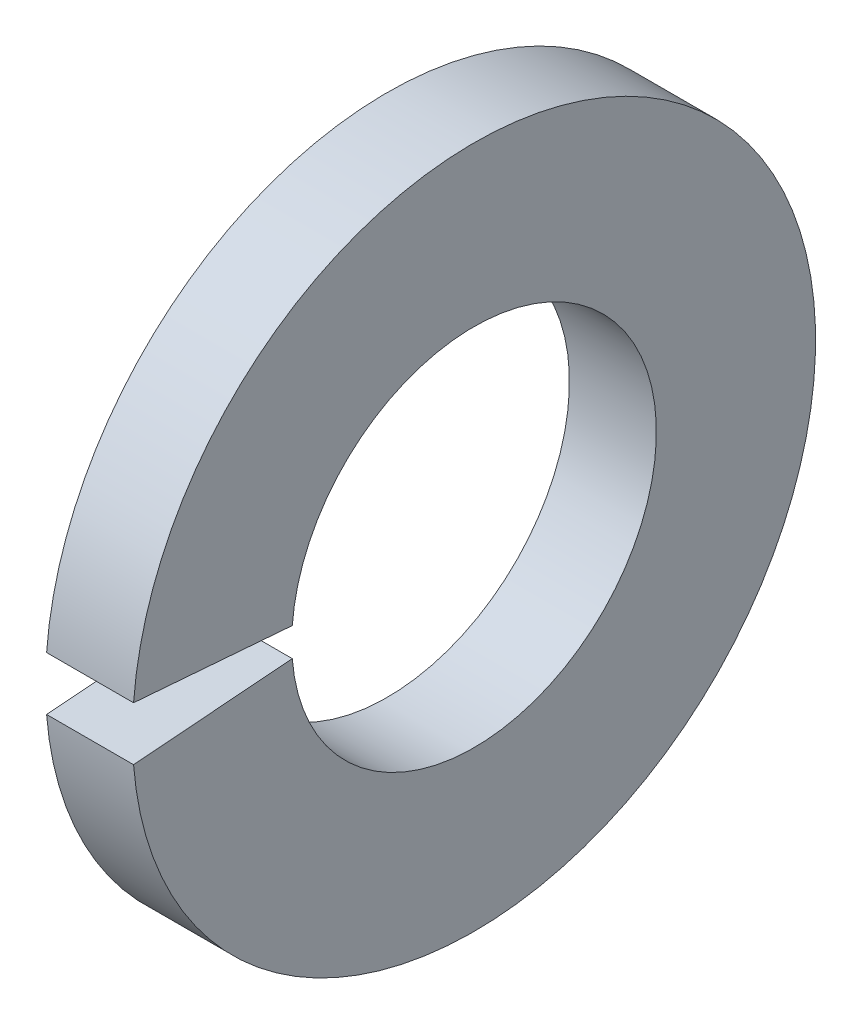
ISO-10303-21;
HEADER;
FILE_DESCRIPTION(('STEP AP214'),'2;1');
FILE_NAME('part.step','',(''),(''),'','','');
FILE_SCHEMA(('AUTOMOTIVE_DESIGN { 1 0 10303 214 1 1 1 1 }'));
ENDSEC;
DATA;
#1=APPLICATION_CONTEXT('core data for automotive mechanical design processes');
#2=APPLICATION_PROTOCOL_DEFINITION('international standard','automotive_design',2000,#1);
#3=PRODUCT_CONTEXT('',#1,'mechanical');
#4=PRODUCT('Part','Part','',(#3));
#5=PRODUCT_RELATED_PRODUCT_CATEGORY('part','',(#4));
#6=PRODUCT_DEFINITION_FORMATION('','',#4);
#7=PRODUCT_DEFINITION_CONTEXT('part definition',#1,'design');
#8=PRODUCT_DEFINITION('design','',#6,#7);
#9=PRODUCT_DEFINITION_SHAPE('','',#8);
#10=(LENGTH_UNIT() NAMED_UNIT(*) SI_UNIT(.MILLI.,.METRE.));
#11=(NAMED_UNIT(*) PLANE_ANGLE_UNIT() SI_UNIT($,.RADIAN.));
#12=(NAMED_UNIT(*) SI_UNIT($,.STERADIAN.) SOLID_ANGLE_UNIT());
#13=UNCERTAINTY_MEASURE_WITH_UNIT(LENGTH_MEASURE(1.E-05),#10,'distance_accuracy_value','');
#14=(GEOMETRIC_REPRESENTATION_CONTEXT(3) GLOBAL_UNCERTAINTY_ASSIGNED_CONTEXT((#13)) GLOBAL_UNIT_ASSIGNED_CONTEXT((#10,
#11,#12)) REPRESENTATION_CONTEXT('',''));
#15=CARTESIAN_POINT('',(0.,0.,0.));
#16=DIRECTION('',(0.,0.,1.));
#17=DIRECTION('',(1.,0.,0.));
#18=AXIS2_PLACEMENT_3D('',#15,#16,#17);
#19=CARTESIAN_POINT('',(-34.9249999999999,0.,0.));
#20=DIRECTION('',(-1.,0.,0.));
#21=DIRECTION('',(0.,0.,1.));
#22=AXIS2_PLACEMENT_3D('',#19,#20,#21);
#23=CYLINDRICAL_SURFACE('',#22,3.302);
#24=CARTESIAN_POINT('',(0.,0.,0.));
#25=DIRECTION('',(-1.,0.,0.));
#26=DIRECTION('',(0.,0.,1.));
#27=AXIS2_PLACEMENT_3D('',#24,#25,#26);
#28=CIRCLE('',#27,3.302);
#29=CARTESIAN_POINT('',(0.,0.259071934093346,3.2918210359868));
#30=VERTEX_POINT('',#29);
#31=CARTESIAN_POINT('',(0.,-0.259071934093346,3.2918210359868));
#32=VERTEX_POINT('',#31);
#33=EDGE_CURVE('E85',#30,#32,#28,.T.);
#34=ORIENTED_EDGE('',*,*,#33,.F.);
#35=DIRECTION('',(-1.,0.,0.));
#36=VECTOR('',#35,1.);
#37=CARTESIAN_POINT('',(-34.9249999999999,0.259071934093346,3.2918210359868));
#38=LINE('',#37,#36);
#39=CARTESIAN_POINT('',(-1.5748,0.259071934093346,3.2918210359868));
#40=VERTEX_POINT('',#39);
#41=EDGE_CURVE('E99',#30,#40,#38,.T.);
#42=ORIENTED_EDGE('',*,*,#41,.T.);
#43=CARTESIAN_POINT('',(-1.5748,0.,0.));
#44=DIRECTION('',(-1.,0.,0.));
#45=DIRECTION('',(0.,0.,1.));
#46=AXIS2_PLACEMENT_3D('',#43,#44,#45);
#47=CIRCLE('',#46,3.302);
#48=CARTESIAN_POINT('',(-1.5748,-0.259071934093344,3.2918210359868));
#49=VERTEX_POINT('',#48);
#50=EDGE_CURVE('E87',#40,#49,#47,.T.);
#51=ORIENTED_EDGE('',*,*,#50,.T.);
#52=DIRECTION('',(-1.,0.,0.));
#53=VECTOR('',#52,1.);
#54=CARTESIAN_POINT('',(-34.9249999999999,-0.259071934093346,3.2918210359868));
#55=LINE('',#54,#53);
#56=EDGE_CURVE('E55',#32,#49,#55,.T.);
#57=ORIENTED_EDGE('',*,*,#56,.F.);
#58=EDGE_LOOP('',(#34,#42,#51,#57));
#59=FACE_BOUND('',#58,.T.);
#60=ADVANCED_FACE('F34',(#59),#23,.F.);
#61=CARTESIAN_POINT('',(0.,3.302,0.));
#62=DIRECTION('',(-1.,0.,0.));
#63=DIRECTION('',(0.,0.,1.));
#64=AXIS2_PLACEMENT_3D('',#61,#62,#63);
#65=PLANE('',#64);
#66=CARTESIAN_POINT('',(0.,0.,0.));
#67=DIRECTION('',(-1.,0.,0.));
#68=DIRECTION('',(0.,0.,1.));
#69=AXIS2_PLACEMENT_3D('',#66,#67,#68);
#70=CIRCLE('',#69,6.1849);
#71=CARTESIAN_POINT('',(0.,0.485261661167153,6.165834017406));
#72=VERTEX_POINT('',#71);
#73=CARTESIAN_POINT('',(0.,-0.485261661167153,6.165834017406));
#74=VERTEX_POINT('',#73);
#75=EDGE_CURVE('E91',#72,#74,#70,.T.);
#76=ORIENTED_EDGE('',*,*,#75,.F.);
#77=DIRECTION('',(0.,0.0784590957278457,0.996917333733128));
#78=VECTOR('',#77,1.);
#79=CARTESIAN_POINT('',(0.,0.,0.));
#80=LINE('',#79,#78);
#81=EDGE_CURVE('E79',#30,#72,#80,.T.);
#82=ORIENTED_EDGE('',*,*,#81,.F.);
#83=ORIENTED_EDGE('',*,*,#33,.T.);
#84=DIRECTION('',(0.,-0.0784590957278457,0.996917333733128));
#85=VECTOR('',#84,1.);
#86=CARTESIAN_POINT('',(0.,0.,0.));
#87=LINE('',#86,#85);
#88=EDGE_CURVE('E71',#32,#74,#87,.T.);
#89=ORIENTED_EDGE('',*,*,#88,.T.);
#90=EDGE_LOOP('',(#76,#82,#83,#89));
#91=FACE_BOUND('',#90,.T.);
#92=ADVANCED_FACE('F90',(#91),#65,.F.);
#93=CARTESIAN_POINT('',(-34.9249999999999,0.,0.));
#94=DIRECTION('',(-1.,0.,0.));
#95=DIRECTION('',(0.,0.,1.));
#96=AXIS2_PLACEMENT_3D('',#93,#94,#95);
#97=CYLINDRICAL_SURFACE('',#96,6.1849);
#98=CARTESIAN_POINT('',(-1.5748,0.,0.));
#99=DIRECTION('',(-1.,0.,0.));
#100=DIRECTION('',(0.,0.,1.));
#101=AXIS2_PLACEMENT_3D('',#98,#99,#100);
#102=CIRCLE('',#101,6.1849);
#103=CARTESIAN_POINT('',(-1.5748,0.485261661167155,6.165834017406));
#104=VERTEX_POINT('',#103);
#105=CARTESIAN_POINT('',(-1.5748,-0.485261661167153,6.165834017406));
#106=VERTEX_POINT('',#105);
#107=EDGE_CURVE('E93',#104,#106,#102,.T.);
#108=ORIENTED_EDGE('',*,*,#107,.F.);
#109=DIRECTION('',(-1.,0.,0.));
#110=VECTOR('',#109,1.);
#111=CARTESIAN_POINT('',(-34.9249999999999,0.485261661167153,6.165834017406));
#112=LINE('',#111,#110);
#113=EDGE_CURVE('E48',#104,#72,#112,.F.);
#114=ORIENTED_EDGE('',*,*,#113,.T.);
#115=ORIENTED_EDGE('',*,*,#75,.T.);
#116=DIRECTION('',(-1.,0.,0.));
#117=VECTOR('',#116,1.);
#118=CARTESIAN_POINT('',(-34.9249999999999,-0.485261661167153,6.165834017406));
#119=LINE('',#118,#117);
#120=EDGE_CURVE('E74',#106,#74,#119,.F.);
#121=ORIENTED_EDGE('',*,*,#120,.F.);
#122=EDGE_LOOP('',(#108,#114,#115,#121));
#123=FACE_BOUND('',#122,.T.);
#124=ADVANCED_FACE('F106',(#123),#97,.T.);
#125=CARTESIAN_POINT('',(-1.5748,6.1849,0.));
#126=DIRECTION('',(1.,0.,0.));
#127=DIRECTION('',(0.,0.,-1.));
#128=AXIS2_PLACEMENT_3D('',#125,#126,#127);
#129=PLANE('',#128);
#130=ORIENTED_EDGE('',*,*,#50,.F.);
#131=DIRECTION('',(0.,0.0784590957278457,0.996917333733128));
#132=VECTOR('',#131,1.);
#133=CARTESIAN_POINT('',(-1.5748,0.038073191126569,0.483765761413679));
#134=LINE('',#133,#132);
#135=EDGE_CURVE('E11',#40,#104,#134,.T.);
#136=ORIENTED_EDGE('',*,*,#135,.T.);
#137=ORIENTED_EDGE('',*,*,#107,.T.);
#138=DIRECTION('',(0.,-0.0784590957278457,0.996917333733128));
#139=VECTOR('',#138,1.);
#140=CARTESIAN_POINT('',(-1.5748,0.038073191126569,-0.483765761413679));
#141=LINE('',#140,#139);
#142=EDGE_CURVE('E41',#49,#106,#141,.T.);
#143=ORIENTED_EDGE('',*,*,#142,.F.);
#144=EDGE_LOOP('',(#130,#136,#137,#143));
#145=FACE_BOUND('',#144,.T.);
#146=ADVANCED_FACE('F108',(#145),#129,.F.);
#147=CARTESIAN_POINT('',(-1.5748,0.,0.));
#148=DIRECTION('',(0.,0.996917333733128,0.0784590957278457));
#149=DIRECTION('',(0.,-0.0784590957278457,0.996917333733128));
#150=AXIS2_PLACEMENT_3D('',#147,#148,#149);
#151=PLANE('',#150);
#152=ORIENTED_EDGE('',*,*,#56,.T.);
#153=ORIENTED_EDGE('',*,*,#142,.T.);
#154=ORIENTED_EDGE('',*,*,#120,.T.);
#155=ORIENTED_EDGE('',*,*,#88,.F.);
#156=EDGE_LOOP('',(#152,#153,#154,#155));
#157=FACE_BOUND('',#156,.T.);
#158=ADVANCED_FACE('F72',(#157),#151,.T.);
#159=CARTESIAN_POINT('',(-1.5748,0.,0.));
#160=DIRECTION('',(0.,0.996917333733128,-0.0784590957278457));
#161=DIRECTION('',(0.,0.0784590957278457,0.996917333733128));
#162=AXIS2_PLACEMENT_3D('',#159,#160,#161);
#163=PLANE('',#162);
#164=ORIENTED_EDGE('',*,*,#81,.T.);
#165=ORIENTED_EDGE('',*,*,#113,.F.);
#166=ORIENTED_EDGE('',*,*,#135,.F.);
#167=ORIENTED_EDGE('',*,*,#41,.F.);
#168=EDGE_LOOP('',(#164,#165,#166,#167));
#169=FACE_BOUND('',#168,.T.);
#170=ADVANCED_FACE('F103',(#169),#163,.F.);
#171=CLOSED_SHELL('',(#60,#92,#124,#146,#158,#170));
#172=MANIFOLD_SOLID_BREP('B2',#171);
#173=ADVANCED_BREP_SHAPE_REPRESENTATION('',(#18,#172),#14);
#174=SHAPE_DEFINITION_REPRESENTATION(#9,#173);
ENDSEC;
END-ISO-10303-21;
